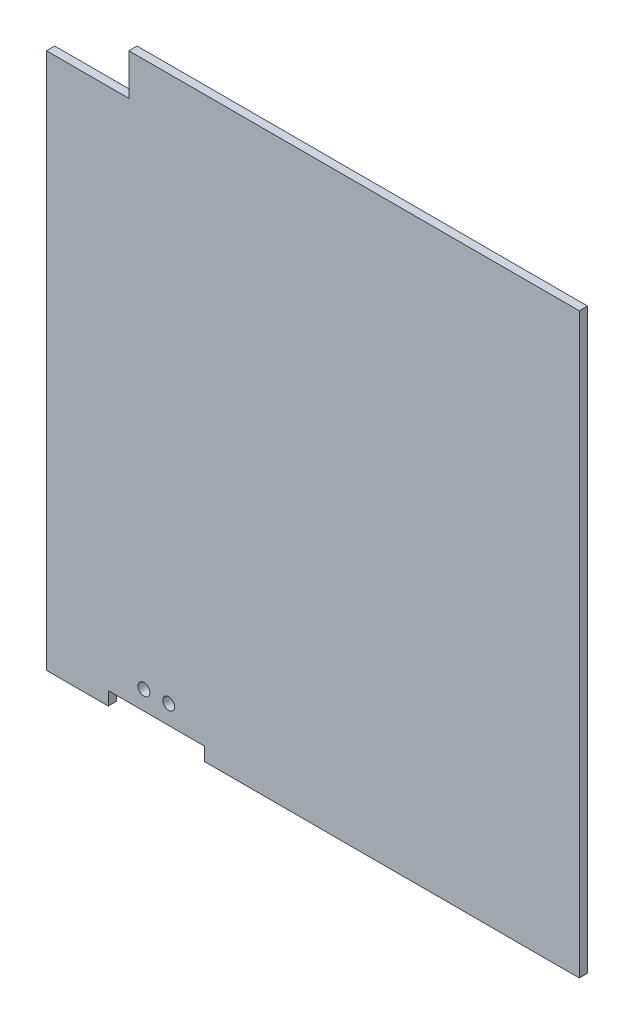
ISO-10303-21;
HEADER;
FILE_DESCRIPTION(('STEP AP214'),'2;1');
FILE_NAME('part.step','',(''),(''),'','','');
FILE_SCHEMA(('AUTOMOTIVE_DESIGN { 1 0 10303 214 1 1 1 1 }'));
ENDSEC;
DATA;
#1=APPLICATION_CONTEXT('core data for automotive mechanical design processes');
#2=APPLICATION_PROTOCOL_DEFINITION('international standard','automotive_design',2000,#1);
#3=PRODUCT_CONTEXT('',#1,'mechanical');
#4=PRODUCT('Part','Part','',(#3));
#5=PRODUCT_RELATED_PRODUCT_CATEGORY('part','',(#4));
#6=PRODUCT_DEFINITION_FORMATION('','',#4);
#7=PRODUCT_DEFINITION_CONTEXT('part definition',#1,'design');
#8=PRODUCT_DEFINITION('design','',#6,#7);
#9=PRODUCT_DEFINITION_SHAPE('','',#8);
#10=(LENGTH_UNIT() NAMED_UNIT(*) SI_UNIT(.MILLI.,.METRE.));
#11=(NAMED_UNIT(*) PLANE_ANGLE_UNIT() SI_UNIT($,.RADIAN.));
#12=(NAMED_UNIT(*) SI_UNIT($,.STERADIAN.) SOLID_ANGLE_UNIT());
#13=UNCERTAINTY_MEASURE_WITH_UNIT(LENGTH_MEASURE(1.E-05),#10,'distance_accuracy_value','');
#14=(GEOMETRIC_REPRESENTATION_CONTEXT(3) GLOBAL_UNCERTAINTY_ASSIGNED_CONTEXT((#13)) GLOBAL_UNIT_ASSIGNED_CONTEXT((#10,
#11,#12)) REPRESENTATION_CONTEXT('',''));
#15=CARTESIAN_POINT('',(0.,0.,0.));
#16=DIRECTION('',(0.,0.,1.));
#17=DIRECTION('',(1.,0.,0.));
#18=AXIS2_PLACEMENT_3D('',#15,#16,#17);
#19=CARTESIAN_POINT('',(80.,123.5,282.5902628481));
#20=DIRECTION('',(0.,1.,0.));
#21=DIRECTION('',(0.,0.,1.));
#22=AXIS2_PLACEMENT_3D('',#19,#20,#21);
#23=PLANE('',#22);
#24=DIRECTION('',(1.,0.,0.));
#25=VECTOR('',#24,1.);
#26=CARTESIAN_POINT('',(80.,123.5,3.));
#27=LINE('',#26,#25);
#28=CARTESIAN_POINT('',(-93.9999999999999,123.5,3.));
#29=VERTEX_POINT('',#28);
#30=CARTESIAN_POINT('',(-63.9999999999999,123.5,3.));
#31=VERTEX_POINT('',#30);
#32=EDGE_CURVE('E226',#29,#31,#27,.T.);
#33=ORIENTED_EDGE('',*,*,#32,.T.);
#34=DIRECTION('',(0.,0.,-1.));
#35=VECTOR('',#34,1.);
#36=CARTESIAN_POINT('',(-63.9999999999999,123.5,167.684546937471));
#37=LINE('',#36,#35);
#38=CARTESIAN_POINT('',(-63.9999999999999,123.5,0.));
#39=VERTEX_POINT('',#38);
#40=EDGE_CURVE('E237',#31,#39,#37,.T.);
#41=ORIENTED_EDGE('',*,*,#40,.T.);
#42=DIRECTION('',(1.,0.,0.));
#43=VECTOR('',#42,1.);
#44=CARTESIAN_POINT('',(80.,123.5,0.));
#45=LINE('',#44,#43);
#46=CARTESIAN_POINT('',(-93.9999999999999,123.5,0.));
#47=VERTEX_POINT('',#46);
#48=EDGE_CURVE('E269',#47,#39,#45,.T.);
#49=ORIENTED_EDGE('',*,*,#48,.F.);
#50=DIRECTION('',(0.,0.,-1.));
#51=VECTOR('',#50,1.);
#52=CARTESIAN_POINT('',(-93.9999999999999,123.5,3.));
#53=LINE('',#52,#51);
#54=EDGE_CURVE('E259',#29,#47,#53,.T.);
#55=ORIENTED_EDGE('',*,*,#54,.F.);
#56=EDGE_LOOP('',(#33,#41,#49,#55));
#57=FACE_BOUND('',#56,.T.);
#58=ADVANCED_FACE('F135',(#57),#23,.T.);
#59=CARTESIAN_POINT('',(0.,0.,3.));
#60=DIRECTION('',(0.,0.,1.));
#61=DIRECTION('',(1.,0.,0.));
#62=AXIS2_PLACEMENT_3D('',#59,#60,#61);
#63=PLANE('',#62);
#64=DIRECTION('',(0.,-1.,0.));
#65=VECTOR('',#64,1.);
#66=CARTESIAN_POINT('',(-93.9999999999999,-71.8732711490231,3.));
#67=LINE('',#66,#65);
#68=CARTESIAN_POINT('',(-93.9999999999999,-71.8732711490231,3.));
#69=VERTEX_POINT('',#68);
#70=EDGE_CURVE('E159',#29,#69,#67,.T.);
#71=ORIENTED_EDGE('',*,*,#70,.T.);
#72=DIRECTION('',(1.,0.,0.));
#73=VECTOR('',#72,1.);
#74=CARTESIAN_POINT('',(88.,-71.8732711490231,3.));
#75=LINE('',#74,#73);
#76=CARTESIAN_POINT('',(-71.5,-71.8732711490231,3.));
#77=VERTEX_POINT('',#76);
#78=EDGE_CURVE('E280',#69,#77,#75,.T.);
#79=ORIENTED_EDGE('',*,*,#78,.T.);
#80=DIRECTION('',(0.,-1.,0.));
#81=VECTOR('',#80,1.);
#82=CARTESIAN_POINT('',(-71.5000000000002,-1.80411241501588E-13,3.));
#83=LINE('',#82,#81);
#84=CARTESIAN_POINT('',(-71.5,-67.,3.));
#85=VERTEX_POINT('',#84);
#86=EDGE_CURVE('E331',#85,#77,#83,.T.);
#87=ORIENTED_EDGE('',*,*,#86,.F.);
#88=DIRECTION('',(-1.,0.,0.));
#89=VECTOR('',#88,1.);
#90=CARTESIAN_POINT('',(0.,-67.,3.));
#91=LINE('',#90,#89);
#92=CARTESIAN_POINT('',(-36.5,-67.,3.));
#93=VERTEX_POINT('',#92);
#94=EDGE_CURVE('E12',#93,#85,#91,.T.);
#95=ORIENTED_EDGE('',*,*,#94,.F.);
#96=DIRECTION('',(0.,1.,0.));
#97=VECTOR('',#96,1.);
#98=CARTESIAN_POINT('',(-36.4999999999998,0.,3.));
#99=LINE('',#98,#97);
#100=CARTESIAN_POINT('',(-36.5,-71.8732711490231,3.));
#101=VERTEX_POINT('',#100);
#102=EDGE_CURVE('E144',#101,#93,#99,.T.);
#103=ORIENTED_EDGE('',*,*,#102,.F.);
#104=CARTESIAN_POINT('',(100.,-71.8732711490231,3.));
#105=VERTEX_POINT('',#104);
#106=EDGE_CURVE('E220',#101,#105,#75,.T.);
#107=ORIENTED_EDGE('',*,*,#106,.T.);
#108=DIRECTION('',(0.,-1.,0.));
#109=VECTOR('',#108,1.);
#110=CARTESIAN_POINT('',(100.,-71.8732711490231,3.));
#111=LINE('',#110,#109);
#112=CARTESIAN_POINT('',(100.,138.5,3.));
#113=VERTEX_POINT('',#112);
#114=EDGE_CURVE('E212',#113,#105,#111,.T.);
#115=ORIENTED_EDGE('',*,*,#114,.F.);
#116=DIRECTION('',(1.,0.,0.));
#117=VECTOR('',#116,1.);
#118=CARTESIAN_POINT('',(-63.9999999999999,138.5,3.));
#119=LINE('',#118,#117);
#120=CARTESIAN_POINT('',(-63.9999999999999,138.5,3.));
#121=VERTEX_POINT('',#120);
#122=EDGE_CURVE('E217',#121,#113,#119,.T.);
#123=ORIENTED_EDGE('',*,*,#122,.F.);
#124=DIRECTION('',(0.,1.,0.));
#125=VECTOR('',#124,1.);
#126=CARTESIAN_POINT('',(-63.9999999999999,123.5,3.));
#127=LINE('',#126,#125);
#128=EDGE_CURVE('E249',#31,#121,#127,.T.);
#129=ORIENTED_EDGE('',*,*,#128,.F.);
#130=ORIENTED_EDGE('',*,*,#32,.F.);
#131=EDGE_LOOP('',(#71,#79,#87,#95,#103,#107,#115,#123,#129,#130));
#132=FACE_BOUND('',#131,.T.);
#133=CARTESIAN_POINT('',(-58.5,-60.1,3.));
#134=DIRECTION('',(0.,0.,1.));
#135=DIRECTION('',(1.,0.,0.));
#136=AXIS2_PLACEMENT_3D('',#133,#134,#135);
#137=CIRCLE('',#136,2.15);
#138=CARTESIAN_POINT('',(-56.35,-60.1,3.));
#139=VERTEX_POINT('',#138);
#140=EDGE_CURVE('E327',#139,#139,#137,.T.);
#141=ORIENTED_EDGE('',*,*,#140,.F.);
#142=EDGE_LOOP('',(#141));
#143=FACE_BOUND('',#142,.T.);
#144=CARTESIAN_POINT('',(-49.5,-60.1,3.));
#145=DIRECTION('',(0.,0.,1.));
#146=DIRECTION('',(1.,0.,0.));
#147=AXIS2_PLACEMENT_3D('',#144,#145,#146);
#148=CIRCLE('',#147,2.15);
#149=CARTESIAN_POINT('',(-47.35,-60.1,3.));
#150=VERTEX_POINT('',#149);
#151=EDGE_CURVE('E313',#150,#150,#148,.T.);
#152=ORIENTED_EDGE('',*,*,#151,.F.);
#153=EDGE_LOOP('',(#152));
#154=FACE_BOUND('',#153,.T.);
#155=ADVANCED_FACE('F214',(#132,#143,#154),#63,.T.);
#156=CARTESIAN_POINT('',(0.,0.,0.));
#157=DIRECTION('',(0.,0.,1.));
#158=DIRECTION('',(1.,0.,0.));
#159=AXIS2_PLACEMENT_3D('',#156,#157,#158);
#160=PLANE('',#159);
#161=DIRECTION('',(-1.,0.,0.));
#162=VECTOR('',#161,1.);
#163=CARTESIAN_POINT('',(0.,-71.8732711490231,0.));
#164=LINE('',#163,#162);
#165=CARTESIAN_POINT('',(-71.5,-71.8732711490231,0.));
#166=VERTEX_POINT('',#165);
#167=CARTESIAN_POINT('',(-93.9999999999999,-71.8732711490231,0.));
#168=VERTEX_POINT('',#167);
#169=EDGE_CURVE('E287',#166,#168,#164,.T.);
#170=ORIENTED_EDGE('',*,*,#169,.T.);
#171=DIRECTION('',(0.,1.,0.));
#172=VECTOR('',#171,1.);
#173=CARTESIAN_POINT('',(-93.9999999999999,0.,0.));
#174=LINE('',#173,#172);
#175=EDGE_CURVE('E262',#168,#47,#174,.T.);
#176=ORIENTED_EDGE('',*,*,#175,.T.);
#177=ORIENTED_EDGE('',*,*,#48,.T.);
#178=DIRECTION('',(0.,1.,0.));
#179=VECTOR('',#178,1.);
#180=CARTESIAN_POINT('',(-63.9999999999999,123.5,0.));
#181=LINE('',#180,#179);
#182=CARTESIAN_POINT('',(-63.9999999999999,138.5,0.));
#183=VERTEX_POINT('',#182);
#184=EDGE_CURVE('E151',#39,#183,#181,.T.);
#185=ORIENTED_EDGE('',*,*,#184,.T.);
#186=DIRECTION('',(1.,0.,0.));
#187=VECTOR('',#186,1.);
#188=CARTESIAN_POINT('',(-63.9999999999999,138.5,0.));
#189=LINE('',#188,#187);
#190=CARTESIAN_POINT('',(100.,138.5,0.));
#191=VERTEX_POINT('',#190);
#192=EDGE_CURVE('E243',#183,#191,#189,.T.);
#193=ORIENTED_EDGE('',*,*,#192,.T.);
#194=DIRECTION('',(0.,-1.,0.));
#195=VECTOR('',#194,1.);
#196=CARTESIAN_POINT('',(100.,-71.8732711490231,0.));
#197=LINE('',#196,#195);
#198=CARTESIAN_POINT('',(100.,-71.8732711490231,0.));
#199=VERTEX_POINT('',#198);
#200=EDGE_CURVE('E232',#191,#199,#197,.T.);
#201=ORIENTED_EDGE('',*,*,#200,.T.);
#202=CARTESIAN_POINT('',(-36.5,-71.8732711490231,0.));
#203=VERTEX_POINT('',#202);
#204=EDGE_CURVE('E292',#199,#203,#164,.T.);
#205=ORIENTED_EDGE('',*,*,#204,.T.);
#206=DIRECTION('',(0.,1.,0.));
#207=VECTOR('',#206,1.);
#208=CARTESIAN_POINT('',(-36.5,-67.,0.));
#209=LINE('',#208,#207);
#210=CARTESIAN_POINT('',(-36.5,-67.,0.));
#211=VERTEX_POINT('',#210);
#212=EDGE_CURVE('E305',#203,#211,#209,.T.);
#213=ORIENTED_EDGE('',*,*,#212,.T.);
#214=DIRECTION('',(-1.,0.,0.));
#215=VECTOR('',#214,1.);
#216=CARTESIAN_POINT('',(-67.7,-67.,0.));
#217=LINE('',#216,#215);
#218=CARTESIAN_POINT('',(-71.5,-67.,0.));
#219=VERTEX_POINT('',#218);
#220=EDGE_CURVE('E296',#211,#219,#217,.T.);
#221=ORIENTED_EDGE('',*,*,#220,.T.);
#222=DIRECTION('',(0.,-1.,0.));
#223=VECTOR('',#222,1.);
#224=CARTESIAN_POINT('',(-71.5,-67.,0.));
#225=LINE('',#224,#223);
#226=EDGE_CURVE('E300',#219,#166,#225,.T.);
#227=ORIENTED_EDGE('',*,*,#226,.T.);
#228=EDGE_LOOP('',(#170,#176,#177,#185,#193,#201,#205,#213,#221,#227));
#229=FACE_BOUND('',#228,.T.);
#230=CARTESIAN_POINT('',(-49.5,-60.1,0.));
#231=DIRECTION('',(0.,0.,1.));
#232=DIRECTION('',(1.,0.,0.));
#233=AXIS2_PLACEMENT_3D('',#230,#231,#232);
#234=CIRCLE('',#233,2.15);
#235=CARTESIAN_POINT('',(-47.35,-60.1,0.));
#236=VERTEX_POINT('',#235);
#237=EDGE_CURVE('E320',#236,#236,#234,.T.);
#238=ORIENTED_EDGE('',*,*,#237,.T.);
#239=EDGE_LOOP('',(#238));
#240=FACE_BOUND('',#239,.T.);
#241=CARTESIAN_POINT('',(-58.5,-60.1,0.));
#242=DIRECTION('',(0.,0.,1.));
#243=DIRECTION('',(1.,0.,0.));
#244=AXIS2_PLACEMENT_3D('',#241,#242,#243);
#245=CIRCLE('',#244,2.15);
#246=CARTESIAN_POINT('',(-56.35,-60.1,0.));
#247=VERTEX_POINT('',#246);
#248=EDGE_CURVE('E301',#247,#247,#245,.T.);
#249=ORIENTED_EDGE('',*,*,#248,.T.);
#250=EDGE_LOOP('',(#249));
#251=FACE_BOUND('',#250,.T.);
#252=ADVANCED_FACE('F137',(#229,#240,#251),#160,.F.);
#253=CARTESIAN_POINT('',(-49.5,-60.1,0.));
#254=DIRECTION('',(0.,0.,1.));
#255=DIRECTION('',(1.,0.,0.));
#256=AXIS2_PLACEMENT_3D('',#253,#254,#255);
#257=CYLINDRICAL_SURFACE('',#256,2.15);
#258=ORIENTED_EDGE('',*,*,#151,.T.);
#259=EDGE_LOOP('',(#258));
#260=FACE_BOUND('',#259,.T.);
#261=ORIENTED_EDGE('',*,*,#237,.F.);
#262=EDGE_LOOP('',(#261));
#263=FACE_BOUND('',#262,.T.);
#264=ADVANCED_FACE('F403',(#260,#263),#257,.F.);
#265=CARTESIAN_POINT('',(-58.5,-60.1,0.));
#266=DIRECTION('',(0.,0.,1.));
#267=DIRECTION('',(1.,0.,0.));
#268=AXIS2_PLACEMENT_3D('',#265,#266,#267);
#269=CYLINDRICAL_SURFACE('',#268,2.15);
#270=ORIENTED_EDGE('',*,*,#140,.T.);
#271=EDGE_LOOP('',(#270));
#272=FACE_BOUND('',#271,.T.);
#273=ORIENTED_EDGE('',*,*,#248,.F.);
#274=EDGE_LOOP('',(#273));
#275=FACE_BOUND('',#274,.T.);
#276=ADVANCED_FACE('F445',(#272,#275),#269,.F.);
#277=CARTESIAN_POINT('',(-40.3,-67.,0.));
#278=DIRECTION('',(0.,1.,0.));
#279=DIRECTION('',(0.,0.,1.));
#280=AXIS2_PLACEMENT_3D('',#277,#278,#279);
#281=PLANE('',#280);
#282=ORIENTED_EDGE('',*,*,#94,.T.);
#283=DIRECTION('',(0.,0.,1.));
#284=VECTOR('',#283,1.);
#285=CARTESIAN_POINT('',(-71.5,-67.,0.));
#286=LINE('',#285,#284);
#287=EDGE_CURVE('E308',#219,#85,#286,.T.);
#288=ORIENTED_EDGE('',*,*,#287,.F.);
#289=ORIENTED_EDGE('',*,*,#220,.F.);
#290=DIRECTION('',(0.,0.,1.));
#291=VECTOR('',#290,1.);
#292=CARTESIAN_POINT('',(-36.5,-67.,0.));
#293=LINE('',#292,#291);
#294=EDGE_CURVE('E309',#211,#93,#293,.T.);
#295=ORIENTED_EDGE('',*,*,#294,.T.);
#296=EDGE_LOOP('',(#282,#288,#289,#295));
#297=FACE_BOUND('',#296,.T.);
#298=ADVANCED_FACE('F342',(#297),#281,.F.);
#299=CARTESIAN_POINT('',(-36.5,-67.,0.));
#300=DIRECTION('',(1.,0.,0.));
#301=DIRECTION('',(0.,1.,0.));
#302=AXIS2_PLACEMENT_3D('',#299,#300,#301);
#303=PLANE('',#302);
#304=ORIENTED_EDGE('',*,*,#212,.F.);
#305=DIRECTION('',(0.,0.,1.));
#306=VECTOR('',#305,1.);
#307=CARTESIAN_POINT('',(-36.5,-71.8732711490231,0.));
#308=LINE('',#307,#306);
#309=EDGE_CURVE('E291',#203,#101,#308,.T.);
#310=ORIENTED_EDGE('',*,*,#309,.T.);
#311=ORIENTED_EDGE('',*,*,#102,.T.);
#312=ORIENTED_EDGE('',*,*,#294,.F.);
#313=EDGE_LOOP('',(#304,#310,#311,#312));
#314=FACE_BOUND('',#313,.T.);
#315=ADVANCED_FACE('F338',(#314),#303,.F.);
#316=CARTESIAN_POINT('',(-71.5,-67.,0.));
#317=DIRECTION('',(-1.,0.,0.));
#318=DIRECTION('',(0.,-1.,0.));
#319=AXIS2_PLACEMENT_3D('',#316,#317,#318);
#320=PLANE('',#319);
#321=ORIENTED_EDGE('',*,*,#86,.T.);
#322=DIRECTION('',(0.,0.,-1.));
#323=VECTOR('',#322,1.);
#324=CARTESIAN_POINT('',(-71.5,-71.8732711490231,0.));
#325=LINE('',#324,#323);
#326=EDGE_CURVE('E283',#77,#166,#325,.T.);
#327=ORIENTED_EDGE('',*,*,#326,.T.);
#328=ORIENTED_EDGE('',*,*,#226,.F.);
#329=ORIENTED_EDGE('',*,*,#287,.T.);
#330=EDGE_LOOP('',(#321,#327,#328,#329));
#331=FACE_BOUND('',#330,.T.);
#332=ADVANCED_FACE('F347',(#331),#320,.F.);
#333=CARTESIAN_POINT('',(88.,-71.8732711490231,3.));
#334=DIRECTION('',(0.,1.,0.));
#335=DIRECTION('',(0.,0.,1.));
#336=AXIS2_PLACEMENT_3D('',#333,#334,#335);
#337=PLANE('',#336);
#338=ORIENTED_EDGE('',*,*,#204,.F.);
#339=DIRECTION('',(0.,0.,-1.));
#340=VECTOR('',#339,1.);
#341=CARTESIAN_POINT('',(100.,-71.8732711490231,282.5902628481));
#342=LINE('',#341,#340);
#343=EDGE_CURVE('E225',#105,#199,#342,.T.);
#344=ORIENTED_EDGE('',*,*,#343,.F.);
#345=ORIENTED_EDGE('',*,*,#106,.F.);
#346=ORIENTED_EDGE('',*,*,#309,.F.);
#347=EDGE_LOOP('',(#338,#344,#345,#346));
#348=FACE_BOUND('',#347,.T.);
#349=ADVANCED_FACE('F355',(#348),#337,.F.);
#350=ORIENTED_EDGE('',*,*,#78,.F.);
#351=DIRECTION('',(0.,0.,-1.));
#352=VECTOR('',#351,1.);
#353=CARTESIAN_POINT('',(-93.9999999999999,-71.8732711490231,3.));
#354=LINE('',#353,#352);
#355=EDGE_CURVE('E258',#69,#168,#354,.T.);
#356=ORIENTED_EDGE('',*,*,#355,.T.);
#357=ORIENTED_EDGE('',*,*,#169,.F.);
#358=ORIENTED_EDGE('',*,*,#326,.F.);
#359=EDGE_LOOP('',(#350,#356,#357,#358));
#360=FACE_BOUND('',#359,.T.);
#361=ADVANCED_FACE('F357',(#360),#337,.F.);
#362=CARTESIAN_POINT('',(100.,-71.8732711490231,282.5902628481));
#363=DIRECTION('',(1.,0.,0.));
#364=DIRECTION('',(0.,0.,-1.));
#365=AXIS2_PLACEMENT_3D('',#362,#363,#364);
#366=PLANE('',#365);
#367=ORIENTED_EDGE('',*,*,#200,.F.);
#368=DIRECTION('',(0.,0.,-1.));
#369=VECTOR('',#368,1.);
#370=CARTESIAN_POINT('',(100.,138.5,167.684546937471));
#371=LINE('',#370,#369);
#372=EDGE_CURVE('E229',#113,#191,#371,.T.);
#373=ORIENTED_EDGE('',*,*,#372,.F.);
#374=ORIENTED_EDGE('',*,*,#114,.T.);
#375=ORIENTED_EDGE('',*,*,#343,.T.);
#376=EDGE_LOOP('',(#367,#373,#374,#375));
#377=FACE_BOUND('',#376,.T.);
#378=ADVANCED_FACE('F230',(#377),#366,.T.);
#379=CARTESIAN_POINT('',(-93.9999999999999,-71.8732711490231,3.));
#380=DIRECTION('',(1.,0.,0.));
#381=DIRECTION('',(0.,0.,-1.));
#382=AXIS2_PLACEMENT_3D('',#379,#380,#381);
#383=PLANE('',#382);
#384=ORIENTED_EDGE('',*,*,#355,.F.);
#385=ORIENTED_EDGE('',*,*,#70,.F.);
#386=ORIENTED_EDGE('',*,*,#54,.T.);
#387=ORIENTED_EDGE('',*,*,#175,.F.);
#388=EDGE_LOOP('',(#384,#385,#386,#387));
#389=FACE_BOUND('',#388,.T.);
#390=ADVANCED_FACE('F378',(#389),#383,.F.);
#391=CARTESIAN_POINT('',(-63.9999999999999,138.5,167.684546937471));
#392=DIRECTION('',(0.,1.,0.));
#393=DIRECTION('',(-1.,0.,0.));
#394=AXIS2_PLACEMENT_3D('',#391,#392,#393);
#395=PLANE('',#394);
#396=DIRECTION('',(0.,0.,-1.));
#397=VECTOR('',#396,1.);
#398=CARTESIAN_POINT('',(-63.9999999999999,138.5,167.684546937471));
#399=LINE('',#398,#397);
#400=EDGE_CURVE('E241',#121,#183,#399,.T.);
#401=ORIENTED_EDGE('',*,*,#400,.F.);
#402=ORIENTED_EDGE('',*,*,#122,.T.);
#403=ORIENTED_EDGE('',*,*,#372,.T.);
#404=ORIENTED_EDGE('',*,*,#192,.F.);
#405=EDGE_LOOP('',(#401,#402,#403,#404));
#406=FACE_BOUND('',#405,.T.);
#407=ADVANCED_FACE('F240',(#406),#395,.T.);
#408=CARTESIAN_POINT('',(-63.9999999999999,123.5,167.684546937471));
#409=DIRECTION('',(-1.,0.,0.));
#410=DIRECTION('',(0.,0.,1.));
#411=AXIS2_PLACEMENT_3D('',#408,#409,#410);
#412=PLANE('',#411);
#413=ORIENTED_EDGE('',*,*,#40,.F.);
#414=ORIENTED_EDGE('',*,*,#128,.T.);
#415=ORIENTED_EDGE('',*,*,#400,.T.);
#416=ORIENTED_EDGE('',*,*,#184,.F.);
#417=EDGE_LOOP('',(#413,#414,#415,#416));
#418=FACE_BOUND('',#417,.T.);
#419=ADVANCED_FACE('F383',(#418),#412,.T.);
#420=CLOSED_SHELL('',(#58,#155,#252,#264,#276,#298,#315,#332,#349,#361,#378,#390,#407,#419));
#421=MANIFOLD_SOLID_BREP('B2',#420);
#422=ADVANCED_BREP_SHAPE_REPRESENTATION('',(#18,#421),#14);
#423=SHAPE_DEFINITION_REPRESENTATION(#9,#422);
ENDSEC;
END-ISO-10303-21;
